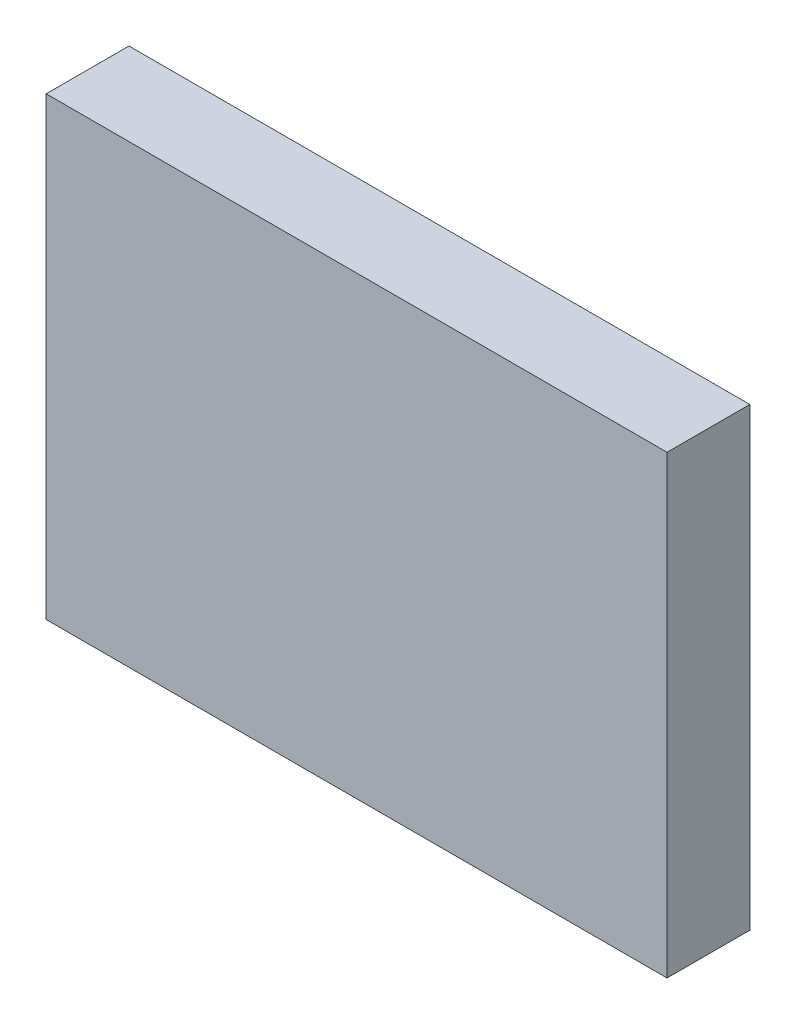
ISO-10303-21;
HEADER;
FILE_DESCRIPTION(('STEP AP214'),'2;1');
FILE_NAME('part.step','',(''),(''),'','','');
FILE_SCHEMA(('AUTOMOTIVE_DESIGN { 1 0 10303 214 1 1 1 1 }'));
ENDSEC;
DATA;
#1=APPLICATION_CONTEXT('core data for automotive mechanical design processes');
#2=APPLICATION_PROTOCOL_DEFINITION('international standard','automotive_design',2000,#1);
#3=PRODUCT_CONTEXT('',#1,'mechanical');
#4=PRODUCT('Part','Part','',(#3));
#5=PRODUCT_RELATED_PRODUCT_CATEGORY('part','',(#4));
#6=PRODUCT_DEFINITION_FORMATION('','',#4);
#7=PRODUCT_DEFINITION_CONTEXT('part definition',#1,'design');
#8=PRODUCT_DEFINITION('design','',#6,#7);
#9=PRODUCT_DEFINITION_SHAPE('','',#8);
#10=(LENGTH_UNIT() NAMED_UNIT(*) SI_UNIT(.MILLI.,.METRE.));
#11=(NAMED_UNIT(*) PLANE_ANGLE_UNIT() SI_UNIT($,.RADIAN.));
#12=(NAMED_UNIT(*) SI_UNIT($,.STERADIAN.) SOLID_ANGLE_UNIT());
#13=UNCERTAINTY_MEASURE_WITH_UNIT(LENGTH_MEASURE(1.E-05),#10,'distance_accuracy_value','');
#14=(GEOMETRIC_REPRESENTATION_CONTEXT(3) GLOBAL_UNCERTAINTY_ASSIGNED_CONTEXT((#13)) GLOBAL_UNIT_ASSIGNED_CONTEXT((#10,
#11,#12)) REPRESENTATION_CONTEXT('',''));
#15=CARTESIAN_POINT('',(0.,0.,0.));
#16=DIRECTION('',(0.,0.,1.));
#17=DIRECTION('',(1.,0.,0.));
#18=AXIS2_PLACEMENT_3D('',#15,#16,#17);
#19=CARTESIAN_POINT('',(0.,0.,10.));
#20=DIRECTION('',(1.,0.,0.));
#21=DIRECTION('',(0.,0.,-1.));
#22=AXIS2_PLACEMENT_3D('',#19,#20,#21);
#23=PLANE('',#22);
#24=DIRECTION('',(0.,-1.,0.));
#25=VECTOR('',#24,1.);
#26=CARTESIAN_POINT('',(0.,0.,0.));
#27=LINE('',#26,#25);
#28=CARTESIAN_POINT('',(0.,55.,0.));
#29=VERTEX_POINT('',#28);
#30=CARTESIAN_POINT('',(0.,0.,0.));
#31=VERTEX_POINT('',#30);
#32=EDGE_CURVE('E98',#29,#31,#27,.T.);
#33=ORIENTED_EDGE('',*,*,#32,.T.);
#34=DIRECTION('',(0.,0.,-1.));
#35=VECTOR('',#34,1.);
#36=CARTESIAN_POINT('',(0.,0.,10.));
#37=LINE('',#36,#35);
#38=CARTESIAN_POINT('',(0.,0.,10.));
#39=VERTEX_POINT('',#38);
#40=EDGE_CURVE('E11',#39,#31,#37,.T.);
#41=ORIENTED_EDGE('',*,*,#40,.F.);
#42=DIRECTION('',(0.,-1.,0.));
#43=VECTOR('',#42,1.);
#44=CARTESIAN_POINT('',(0.,0.,10.));
#45=LINE('',#44,#43);
#46=CARTESIAN_POINT('',(0.,55.,10.));
#47=VERTEX_POINT('',#46);
#48=EDGE_CURVE('E86',#47,#39,#45,.T.);
#49=ORIENTED_EDGE('',*,*,#48,.F.);
#50=DIRECTION('',(0.,0.,-1.));
#51=VECTOR('',#50,1.);
#52=CARTESIAN_POINT('',(0.,55.,10.));
#53=LINE('',#52,#51);
#54=EDGE_CURVE('E94',#47,#29,#53,.T.);
#55=ORIENTED_EDGE('',*,*,#54,.T.);
#56=EDGE_LOOP('',(#33,#41,#49,#55));
#57=FACE_BOUND('',#56,.T.);
#58=ADVANCED_FACE('F35',(#57),#23,.F.);
#59=CARTESIAN_POINT('',(0.,0.,10.));
#60=DIRECTION('',(0.,1.,0.));
#61=DIRECTION('',(0.,0.,1.));
#62=AXIS2_PLACEMENT_3D('',#59,#60,#61);
#63=PLANE('',#62);
#64=DIRECTION('',(1.,0.,0.));
#65=VECTOR('',#64,1.);
#66=CARTESIAN_POINT('',(0.,0.,0.));
#67=LINE('',#66,#65);
#68=CARTESIAN_POINT('',(75.,0.,0.));
#69=VERTEX_POINT('',#68);
#70=EDGE_CURVE('E90',#31,#69,#67,.T.);
#71=ORIENTED_EDGE('',*,*,#70,.T.);
#72=DIRECTION('',(0.,0.,-1.));
#73=VECTOR('',#72,1.);
#74=CARTESIAN_POINT('',(75.,0.,10.));
#75=LINE('',#74,#73);
#76=CARTESIAN_POINT('',(75.,0.,10.));
#77=VERTEX_POINT('',#76);
#78=EDGE_CURVE('E43',#77,#69,#75,.T.);
#79=ORIENTED_EDGE('',*,*,#78,.F.);
#80=DIRECTION('',(1.,0.,0.));
#81=VECTOR('',#80,1.);
#82=CARTESIAN_POINT('',(0.,0.,10.));
#83=LINE('',#82,#81);
#84=EDGE_CURVE('E81',#39,#77,#83,.T.);
#85=ORIENTED_EDGE('',*,*,#84,.F.);
#86=ORIENTED_EDGE('',*,*,#40,.T.);
#87=EDGE_LOOP('',(#71,#79,#85,#86));
#88=FACE_BOUND('',#87,.T.);
#89=ADVANCED_FACE('F89',(#88),#63,.F.);
#90=CARTESIAN_POINT('',(75.,0.,10.));
#91=DIRECTION('',(-1.,0.,0.));
#92=DIRECTION('',(0.,0.,1.));
#93=AXIS2_PLACEMENT_3D('',#90,#91,#92);
#94=PLANE('',#93);
#95=DIRECTION('',(0.,1.,0.));
#96=VECTOR('',#95,1.);
#97=CARTESIAN_POINT('',(75.,0.,0.));
#98=LINE('',#97,#96);
#99=CARTESIAN_POINT('',(75.,55.,0.));
#100=VERTEX_POINT('',#99);
#101=EDGE_CURVE('E68',#69,#100,#98,.T.);
#102=ORIENTED_EDGE('',*,*,#101,.T.);
#103=DIRECTION('',(0.,0.,-1.));
#104=VECTOR('',#103,1.);
#105=CARTESIAN_POINT('',(75.,55.,10.));
#106=LINE('',#105,#104);
#107=CARTESIAN_POINT('',(75.,55.,10.));
#108=VERTEX_POINT('',#107);
#109=EDGE_CURVE('E91',#108,#100,#106,.T.);
#110=ORIENTED_EDGE('',*,*,#109,.F.);
#111=DIRECTION('',(0.,1.,0.));
#112=VECTOR('',#111,1.);
#113=CARTESIAN_POINT('',(75.,0.,10.));
#114=LINE('',#113,#112);
#115=EDGE_CURVE('E84',#77,#108,#114,.T.);
#116=ORIENTED_EDGE('',*,*,#115,.F.);
#117=ORIENTED_EDGE('',*,*,#78,.T.);
#118=EDGE_LOOP('',(#102,#110,#116,#117));
#119=FACE_BOUND('',#118,.T.);
#120=ADVANCED_FACE('F92',(#119),#94,.F.);
#121=CARTESIAN_POINT('',(0.,55.,10.));
#122=DIRECTION('',(0.,-1.,0.));
#123=DIRECTION('',(0.,0.,-1.));
#124=AXIS2_PLACEMENT_3D('',#121,#122,#123);
#125=PLANE('',#124);
#126=DIRECTION('',(-1.,0.,0.));
#127=VECTOR('',#126,1.);
#128=CARTESIAN_POINT('',(0.,55.,0.));
#129=LINE('',#128,#127);
#130=EDGE_CURVE('E74',#100,#29,#129,.T.);
#131=ORIENTED_EDGE('',*,*,#130,.T.);
#132=ORIENTED_EDGE('',*,*,#54,.F.);
#133=DIRECTION('',(-1.,0.,0.));
#134=VECTOR('',#133,1.);
#135=CARTESIAN_POINT('',(0.,55.,10.));
#136=LINE('',#135,#134);
#137=EDGE_CURVE('E51',#108,#47,#136,.T.);
#138=ORIENTED_EDGE('',*,*,#137,.F.);
#139=ORIENTED_EDGE('',*,*,#109,.T.);
#140=EDGE_LOOP('',(#131,#132,#138,#139));
#141=FACE_BOUND('',#140,.T.);
#142=ADVANCED_FACE('F105',(#141),#125,.F.);
#143=CARTESIAN_POINT('',(0.,0.,10.));
#144=DIRECTION('',(0.,0.,-1.));
#145=DIRECTION('',(-1.,0.,0.));
#146=AXIS2_PLACEMENT_3D('',#143,#144,#145);
#147=PLANE('',#146);
#148=ORIENTED_EDGE('',*,*,#48,.T.);
#149=ORIENTED_EDGE('',*,*,#84,.T.);
#150=ORIENTED_EDGE('',*,*,#115,.T.);
#151=ORIENTED_EDGE('',*,*,#137,.T.);
#152=EDGE_LOOP('',(#148,#149,#150,#151));
#153=FACE_BOUND('',#152,.T.);
#154=ADVANCED_FACE('F82',(#153),#147,.F.);
#155=CARTESIAN_POINT('',(0.,0.,0.));
#156=DIRECTION('',(0.,0.,-1.));
#157=DIRECTION('',(-1.,0.,0.));
#158=AXIS2_PLACEMENT_3D('',#155,#156,#157);
#159=PLANE('',#158);
#160=ORIENTED_EDGE('',*,*,#32,.F.);
#161=ORIENTED_EDGE('',*,*,#130,.F.);
#162=ORIENTED_EDGE('',*,*,#101,.F.);
#163=ORIENTED_EDGE('',*,*,#70,.F.);
#164=EDGE_LOOP('',(#160,#161,#162,#163));
#165=FACE_BOUND('',#164,.T.);
#166=ADVANCED_FACE('F108',(#165),#159,.T.);
#167=CLOSED_SHELL('',(#58,#89,#120,#142,#154,#166));
#168=MANIFOLD_SOLID_BREP('B2',#167);
#169=ADVANCED_BREP_SHAPE_REPRESENTATION('',(#18,#168),#14);
#170=SHAPE_DEFINITION_REPRESENTATION(#9,#169);
ENDSEC;
END-ISO-10303-21;
